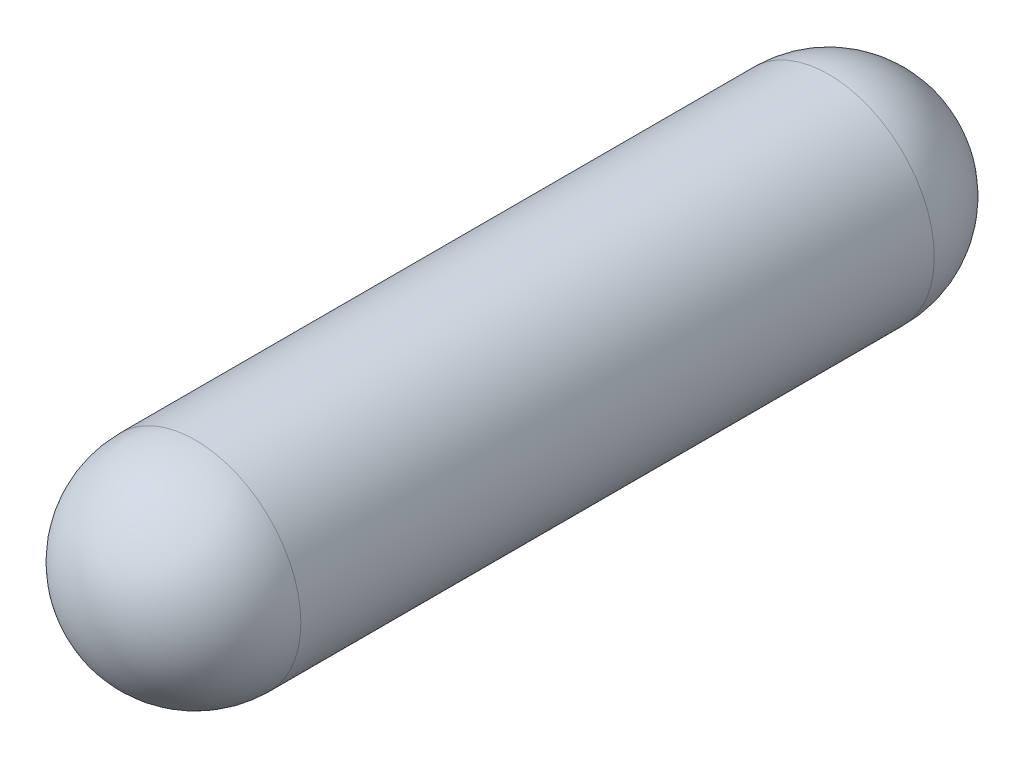
ISO-10303-21;
HEADER;
FILE_DESCRIPTION(('STEP AP214'),'2;1');
FILE_NAME('part.step','',(''),(''),'','','');
FILE_SCHEMA(('AUTOMOTIVE_DESIGN { 1 0 10303 214 1 1 1 1 }'));
ENDSEC;
DATA;
#1=APPLICATION_CONTEXT('core data for automotive mechanical design processes');
#2=APPLICATION_PROTOCOL_DEFINITION('international standard','automotive_design',2000,#1);
#3=PRODUCT_CONTEXT('',#1,'mechanical');
#4=PRODUCT('Part','Part','',(#3));
#5=PRODUCT_RELATED_PRODUCT_CATEGORY('part','',(#4));
#6=PRODUCT_DEFINITION_FORMATION('','',#4);
#7=PRODUCT_DEFINITION_CONTEXT('part definition',#1,'design');
#8=PRODUCT_DEFINITION('design','',#6,#7);
#9=PRODUCT_DEFINITION_SHAPE('','',#8);
#10=(LENGTH_UNIT() NAMED_UNIT(*) SI_UNIT(.MILLI.,.METRE.));
#11=(NAMED_UNIT(*) PLANE_ANGLE_UNIT() SI_UNIT($,.RADIAN.));
#12=(NAMED_UNIT(*) SI_UNIT($,.STERADIAN.) SOLID_ANGLE_UNIT());
#13=UNCERTAINTY_MEASURE_WITH_UNIT(LENGTH_MEASURE(1.E-05),#10,'distance_accuracy_value','');
#14=(GEOMETRIC_REPRESENTATION_CONTEXT(3) GLOBAL_UNCERTAINTY_ASSIGNED_CONTEXT((#13)) GLOBAL_UNIT_ASSIGNED_CONTEXT((#10,
#11,#12)) REPRESENTATION_CONTEXT('',''));
#15=CARTESIAN_POINT('',(0.,0.,0.));
#16=DIRECTION('',(0.,0.,1.));
#17=DIRECTION('',(1.,0.,0.));
#18=AXIS2_PLACEMENT_3D('',#15,#16,#17);
#19=CARTESIAN_POINT('',(0.,0.,8.));
#20=DIRECTION('',(0.,0.,-1.));
#21=DIRECTION('',(-1.,0.,0.));
#22=AXIS2_PLACEMENT_3D('',#19,#20,#21);
#23=CYLINDRICAL_SURFACE('',#22,1.);
#24=CARTESIAN_POINT('',(0.,0.,1.));
#25=DIRECTION('',(0.,0.,-1.));
#26=DIRECTION('',(-1.,0.,0.));
#27=AXIS2_PLACEMENT_3D('',#24,#25,#26);
#28=CIRCLE('',#27,1.);
#29=CARTESIAN_POINT('',(-1.,0.,1.));
#30=VERTEX_POINT('',#29);
#31=EDGE_CURVE('E10',#30,#30,#28,.F.);
#32=ORIENTED_EDGE('',*,*,#31,.T.);
#33=EDGE_LOOP('',(#32));
#34=FACE_BOUND('',#33,.T.);
#35=CARTESIAN_POINT('',(0.,0.,7.));
#36=DIRECTION('',(0.,0.,-1.));
#37=DIRECTION('',(-1.,0.,0.));
#38=AXIS2_PLACEMENT_3D('',#35,#36,#37);
#39=CIRCLE('',#38,1.);
#40=CARTESIAN_POINT('',(-1.,0.,7.));
#41=VERTEX_POINT('',#40);
#42=EDGE_CURVE('E44',#41,#41,#39,.T.);
#43=ORIENTED_EDGE('',*,*,#42,.T.);
#44=EDGE_LOOP('',(#43));
#45=FACE_BOUND('',#44,.T.);
#46=ADVANCED_FACE('F37',(#34,#45),#23,.T.);
#47=CARTESIAN_POINT('',(0.,0.,1.));
#48=DIRECTION('',(0.,0.,1.));
#49=DIRECTION('',(1.,0.,0.));
#50=AXIS2_PLACEMENT_3D('',#47,#48,#49);
#51=SPHERICAL_SURFACE('',#50,1.);
#52=ORIENTED_EDGE('',*,*,#31,.F.);
#53=EDGE_LOOP('',(#52));
#54=FACE_BOUND('',#53,.T.);
#55=ADVANCED_FACE('F52',(#54),#51,.T.);
#56=CARTESIAN_POINT('',(0.,0.,7.));
#57=DIRECTION('',(0.,0.,1.));
#58=DIRECTION('',(1.,0.,0.));
#59=AXIS2_PLACEMENT_3D('',#56,#57,#58);
#60=SPHERICAL_SURFACE('',#59,1.);
#61=ORIENTED_EDGE('',*,*,#42,.F.);
#62=EDGE_LOOP('',(#61));
#63=FACE_BOUND('',#62,.T.);
#64=ADVANCED_FACE('F39',(#63),#60,.T.);
#65=CLOSED_SHELL('',(#46,#55,#64));
#66=MANIFOLD_SOLID_BREP('B2',#65);
#67=ADVANCED_BREP_SHAPE_REPRESENTATION('',(#18,#66),#14);
#68=SHAPE_DEFINITION_REPRESENTATION(#9,#67);
ENDSEC;
END-ISO-10303-21;
